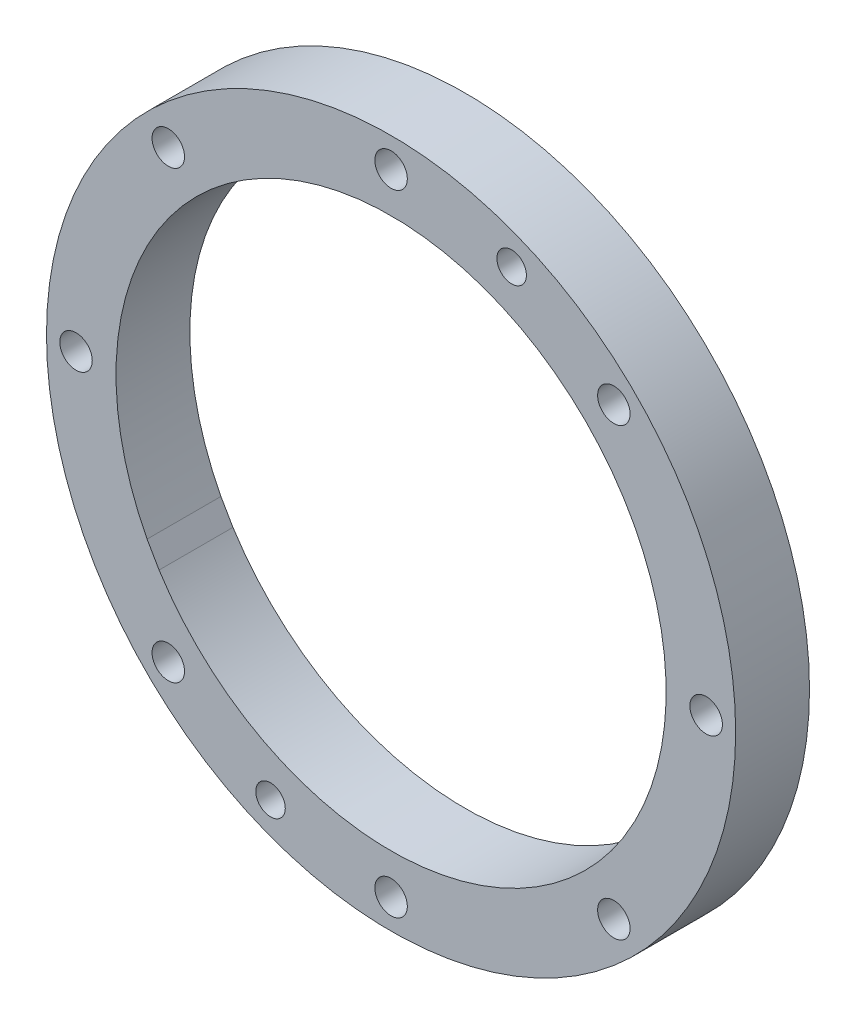
ISO-10303-21;
HEADER;
FILE_DESCRIPTION(('STEP AP214'),'2;1');
FILE_NAME('part.step','',(''),(''),'','','');
FILE_SCHEMA(('AUTOMOTIVE_DESIGN { 1 0 10303 214 1 1 1 1 }'));
ENDSEC;
DATA;
#1=APPLICATION_CONTEXT('core data for automotive mechanical design processes');
#2=APPLICATION_PROTOCOL_DEFINITION('international standard','automotive_design',2000,#1);
#3=PRODUCT_CONTEXT('',#1,'mechanical');
#4=PRODUCT('Part','Part','',(#3));
#5=PRODUCT_RELATED_PRODUCT_CATEGORY('part','',(#4));
#6=PRODUCT_DEFINITION_FORMATION('','',#4);
#7=PRODUCT_DEFINITION_CONTEXT('part definition',#1,'design');
#8=PRODUCT_DEFINITION('design','',#6,#7);
#9=PRODUCT_DEFINITION_SHAPE('','',#8);
#10=(LENGTH_UNIT() NAMED_UNIT(*) SI_UNIT(.MILLI.,.METRE.));
#11=(NAMED_UNIT(*) PLANE_ANGLE_UNIT() SI_UNIT($,.RADIAN.));
#12=(NAMED_UNIT(*) SI_UNIT($,.STERADIAN.) SOLID_ANGLE_UNIT());
#13=UNCERTAINTY_MEASURE_WITH_UNIT(LENGTH_MEASURE(1.E-05),#10,'distance_accuracy_value','');
#14=(GEOMETRIC_REPRESENTATION_CONTEXT(3) GLOBAL_UNCERTAINTY_ASSIGNED_CONTEXT((#13)) GLOBAL_UNIT_ASSIGNED_CONTEXT((#10,
#11,#12)) REPRESENTATION_CONTEXT('',''));
#15=CARTESIAN_POINT('',(0.,0.,0.));
#16=DIRECTION('',(0.,0.,1.));
#17=DIRECTION('',(1.,0.,0.));
#18=AXIS2_PLACEMENT_3D('',#15,#16,#17);
#19=CARTESIAN_POINT('',(0.,0.,7.5));
#20=DIRECTION('',(0.,0.,1.));
#21=DIRECTION('',(1.,0.,0.));
#22=AXIS2_PLACEMENT_3D('',#19,#20,#21);
#23=PLANE('',#22);
#24=CARTESIAN_POINT('',(24.4917396713657,59.1282900807224,7.5));
#25=DIRECTION('',(0.,0.,1.));
#26=DIRECTION('',(1.,0.,0.));
#27=AXIS2_PLACEMENT_3D('',#24,#25,#26);
#28=CIRCLE('',#27,3.);
#29=CARTESIAN_POINT('',(27.4917396713657,59.1282900807224,7.5));
#30=VERTEX_POINT('',#29);
#31=EDGE_CURVE('E407',#30,#30,#28,.T.);
#32=ORIENTED_EDGE('',*,*,#31,.F.);
#33=EDGE_LOOP('',(#32));
#34=FACE_BOUND('',#33,.T.);
#35=CARTESIAN_POINT('',(0.,-64.,7.5));
#36=DIRECTION('',(0.,0.,1.));
#37=DIRECTION('',(1.,0.,0.));
#38=AXIS2_PLACEMENT_3D('',#35,#36,#37);
#39=CIRCLE('',#38,3.3);
#40=CARTESIAN_POINT('',(3.29999999999999,-64.,7.5));
#41=VERTEX_POINT('',#40);
#42=EDGE_CURVE('E425',#41,#41,#39,.T.);
#43=ORIENTED_EDGE('',*,*,#42,.F.);
#44=EDGE_LOOP('',(#43));
#45=FACE_BOUND('',#44,.T.);
#46=CARTESIAN_POINT('',(-64.,0.,7.5));
#47=DIRECTION('',(0.,0.,1.));
#48=DIRECTION('',(1.,0.,0.));
#49=AXIS2_PLACEMENT_3D('',#46,#47,#48);
#50=CIRCLE('',#49,3.3);
#51=CARTESIAN_POINT('',(-60.7,0.,7.5));
#52=VERTEX_POINT('',#51);
#53=EDGE_CURVE('E443',#52,#52,#50,.T.);
#54=ORIENTED_EDGE('',*,*,#53,.F.);
#55=EDGE_LOOP('',(#54));
#56=FACE_BOUND('',#55,.T.);
#57=CARTESIAN_POINT('',(0.,64.,7.5));
#58=DIRECTION('',(0.,0.,1.));
#59=DIRECTION('',(1.,0.,0.));
#60=AXIS2_PLACEMENT_3D('',#57,#58,#59);
#61=CIRCLE('',#60,3.3);
#62=CARTESIAN_POINT('',(3.3,64.,7.5));
#63=VERTEX_POINT('',#62);
#64=EDGE_CURVE('E460',#63,#63,#61,.T.);
#65=ORIENTED_EDGE('',*,*,#64,.F.);
#66=EDGE_LOOP('',(#65));
#67=FACE_BOUND('',#66,.T.);
#68=CARTESIAN_POINT('',(64.,0.,7.5));
#69=DIRECTION('',(0.,0.,1.));
#70=DIRECTION('',(1.,0.,0.));
#71=AXIS2_PLACEMENT_3D('',#68,#69,#70);
#72=CIRCLE('',#71,3.3);
#73=CARTESIAN_POINT('',(67.3,0.,7.5));
#74=VERTEX_POINT('',#73);
#75=EDGE_CURVE('E147',#74,#74,#72,.T.);
#76=ORIENTED_EDGE('',*,*,#75,.F.);
#77=EDGE_LOOP('',(#76));
#78=FACE_BOUND('',#77,.T.);
#79=CARTESIAN_POINT('',(0.,0.,7.5));
#80=DIRECTION('',(0.,0.,1.));
#81=DIRECTION('',(1.,0.,0.));
#82=AXIS2_PLACEMENT_3D('',#79,#80,#81);
#83=CIRCLE('',#82,70.);
#84=CARTESIAN_POINT('',(70.,0.,7.5));
#85=VERTEX_POINT('',#84);
#86=EDGE_CURVE('E11',#85,#85,#83,.T.);
#87=ORIENTED_EDGE('',*,*,#86,.T.);
#88=EDGE_LOOP('',(#87));
#89=FACE_BOUND('',#88,.T.);
#90=DIRECTION('',(-1.,0.,0.));
#91=VECTOR('',#90,1.);
#92=CARTESIAN_POINT('',(2.43723326903816,55.8218193808863,7.5));
#93=LINE('',#92,#91);
#94=CARTESIAN_POINT('',(2.43723326903816,55.8218193808863,7.5));
#95=VERTEX_POINT('',#94);
#96=CARTESIAN_POINT('',(-2.43723326903814,55.8218193808863,7.5));
#97=VERTEX_POINT('',#96);
#98=EDGE_CURVE('E114',#95,#97,#93,.T.);
#99=ORIENTED_EDGE('',*,*,#98,.F.);
#100=CARTESIAN_POINT('',(0.,0.,7.5));
#101=DIRECTION('',(0.,0.,1.));
#102=DIRECTION('',(1.,0.,0.));
#103=AXIS2_PLACEMENT_3D('',#100,#101,#102);
#104=CIRCLE('',#103,55.875);
#105=CARTESIAN_POINT('',(49.5617303038331,-25.8002037645075,7.5));
#106=VERTEX_POINT('',#105);
#107=EDGE_CURVE('E103',#106,#95,#104,.T.);
#108=ORIENTED_EDGE('',*,*,#107,.F.);
#109=DIRECTION('',(0.499999999999999,0.866025403784439,0.));
#110=VECTOR('',#109,1.);
#111=CARTESIAN_POINT('',(47.124497034795,-30.0216156163788,7.5));
#112=LINE('',#111,#110);
#113=CARTESIAN_POINT('',(47.124497034795,-30.0216156163788,7.5));
#114=VERTEX_POINT('',#113);
#115=EDGE_CURVE('E141',#114,#106,#112,.T.);
#116=ORIENTED_EDGE('',*,*,#115,.F.);
#117=CARTESIAN_POINT('',(0.,0.,7.5));
#118=DIRECTION('',(0.,0.,1.));
#119=DIRECTION('',(1.,0.,0.));
#120=AXIS2_PLACEMENT_3D('',#117,#118,#119);
#121=CIRCLE('',#120,55.875);
#122=CARTESIAN_POINT('',(-47.124497034795,-30.0216156163788,7.5));
#123=VERTEX_POINT('',#122);
#124=EDGE_CURVE('E138',#123,#114,#121,.T.);
#125=ORIENTED_EDGE('',*,*,#124,.F.);
#126=DIRECTION('',(0.499999999999999,-0.866025403784439,0.));
#127=VECTOR('',#126,1.);
#128=CARTESIAN_POINT('',(-49.5617303038331,-25.8002037645075,7.5));
#129=LINE('',#128,#127);
#130=CARTESIAN_POINT('',(-49.5617303038332,-25.8002037645075,7.5));
#131=VERTEX_POINT('',#130);
#132=EDGE_CURVE('E135',#131,#123,#129,.T.);
#133=ORIENTED_EDGE('',*,*,#132,.F.);
#134=CARTESIAN_POINT('',(0.,0.,7.5));
#135=DIRECTION('',(0.,0.,1.));
#136=DIRECTION('',(1.,0.,0.));
#137=AXIS2_PLACEMENT_3D('',#134,#135,#136);
#138=CIRCLE('',#137,55.875);
#139=EDGE_CURVE('E126',#97,#131,#138,.T.);
#140=ORIENTED_EDGE('',*,*,#139,.F.);
#141=EDGE_LOOP('',(#99,#108,#116,#125,#133,#140));
#142=FACE_BOUND('',#141,.T.);
#143=CARTESIAN_POINT('',(45.254833995939,45.254833995939,7.5));
#144=DIRECTION('',(0.,0.,1.));
#145=DIRECTION('',(1.,0.,0.));
#146=AXIS2_PLACEMENT_3D('',#143,#144,#145);
#147=CIRCLE('',#146,3.3);
#148=CARTESIAN_POINT('',(48.554833995939,45.254833995939,7.5));
#149=VERTEX_POINT('',#148);
#150=EDGE_CURVE('E463',#149,#149,#147,.T.);
#151=ORIENTED_EDGE('',*,*,#150,.F.);
#152=EDGE_LOOP('',(#151));
#153=FACE_BOUND('',#152,.T.);
#154=CARTESIAN_POINT('',(-45.254833995939,45.254833995939,7.5));
#155=DIRECTION('',(0.,0.,1.));
#156=DIRECTION('',(1.,0.,0.));
#157=AXIS2_PLACEMENT_3D('',#154,#155,#156);
#158=CIRCLE('',#157,3.3);
#159=CARTESIAN_POINT('',(-41.954833995939,45.254833995939,7.5));
#160=VERTEX_POINT('',#159);
#161=EDGE_CURVE('E447',#160,#160,#158,.T.);
#162=ORIENTED_EDGE('',*,*,#161,.F.);
#163=EDGE_LOOP('',(#162));
#164=FACE_BOUND('',#163,.T.);
#165=CARTESIAN_POINT('',(-45.2548339959391,-45.254833995939,7.5));
#166=DIRECTION('',(0.,0.,1.));
#167=DIRECTION('',(1.,0.,0.));
#168=AXIS2_PLACEMENT_3D('',#165,#166,#167);
#169=CIRCLE('',#168,3.3);
#170=CARTESIAN_POINT('',(-41.9548339959391,-45.254833995939,7.5));
#171=VERTEX_POINT('',#170);
#172=EDGE_CURVE('E434',#171,#171,#169,.T.);
#173=ORIENTED_EDGE('',*,*,#172,.F.);
#174=EDGE_LOOP('',(#173));
#175=FACE_BOUND('',#174,.T.);
#176=CARTESIAN_POINT('',(45.254833995939,-45.2548339959391,7.5));
#177=DIRECTION('',(0.,0.,1.));
#178=DIRECTION('',(1.,0.,0.));
#179=AXIS2_PLACEMENT_3D('',#176,#177,#178);
#180=CIRCLE('',#179,3.3);
#181=CARTESIAN_POINT('',(48.554833995939,-45.2548339959391,7.5));
#182=VERTEX_POINT('',#181);
#183=EDGE_CURVE('E420',#182,#182,#180,.T.);
#184=ORIENTED_EDGE('',*,*,#183,.F.);
#185=EDGE_LOOP('',(#184));
#186=FACE_BOUND('',#185,.T.);
#187=CARTESIAN_POINT('',(-24.4917396713657,-59.1282900807224,7.5));
#188=DIRECTION('',(0.,0.,1.));
#189=DIRECTION('',(1.,0.,0.));
#190=AXIS2_PLACEMENT_3D('',#187,#188,#189);
#191=CIRCLE('',#190,3.);
#192=CARTESIAN_POINT('',(-21.4917396713657,-59.1282900807224,7.5));
#193=VERTEX_POINT('',#192);
#194=EDGE_CURVE('E396',#193,#193,#191,.T.);
#195=ORIENTED_EDGE('',*,*,#194,.F.);
#196=EDGE_LOOP('',(#195));
#197=FACE_BOUND('',#196,.T.);
#198=ADVANCED_FACE('F51',(#34,#45,#56,#67,#78,#89,#142,#153,#164,#175,#186,#197),#23,.T.);
#199=CARTESIAN_POINT('',(0.,0.,-7.5));
#200=DIRECTION('',(0.,0.,1.));
#201=DIRECTION('',(1.,0.,0.));
#202=AXIS2_PLACEMENT_3D('',#199,#200,#201);
#203=PLANE('',#202);
#204=CARTESIAN_POINT('',(0.,0.,-7.5));
#205=DIRECTION('',(0.,0.,1.));
#206=DIRECTION('',(1.,0.,0.));
#207=AXIS2_PLACEMENT_3D('',#204,#205,#206);
#208=CIRCLE('',#207,70.);
#209=CARTESIAN_POINT('',(70.,0.,-7.5));
#210=VERTEX_POINT('',#209);
#211=EDGE_CURVE('E54',#210,#210,#208,.T.);
#212=ORIENTED_EDGE('',*,*,#211,.F.);
#213=EDGE_LOOP('',(#212));
#214=FACE_BOUND('',#213,.T.);
#215=CARTESIAN_POINT('',(0.,0.,-7.5));
#216=DIRECTION('',(0.,0.,1.));
#217=DIRECTION('',(1.,0.,0.));
#218=AXIS2_PLACEMENT_3D('',#215,#216,#217);
#219=CIRCLE('',#218,55.875);
#220=CARTESIAN_POINT('',(49.5617303038331,-25.8002037645075,-7.5));
#221=VERTEX_POINT('',#220);
#222=CARTESIAN_POINT('',(2.43723326903816,55.8218193808863,-7.5));
#223=VERTEX_POINT('',#222);
#224=EDGE_CURVE('E75',#221,#223,#219,.T.);
#225=ORIENTED_EDGE('',*,*,#224,.T.);
#226=DIRECTION('',(-1.,0.,0.));
#227=VECTOR('',#226,1.);
#228=CARTESIAN_POINT('',(2.43723326903816,55.8218193808863,-7.5));
#229=LINE('',#228,#227);
#230=CARTESIAN_POINT('',(-2.43723326903814,55.8218193808863,-7.5));
#231=VERTEX_POINT('',#230);
#232=EDGE_CURVE('E123',#223,#231,#229,.T.);
#233=ORIENTED_EDGE('',*,*,#232,.T.);
#234=CARTESIAN_POINT('',(0.,0.,-7.5));
#235=DIRECTION('',(0.,0.,1.));
#236=DIRECTION('',(1.,0.,0.));
#237=AXIS2_PLACEMENT_3D('',#234,#235,#236);
#238=CIRCLE('',#237,55.875);
#239=CARTESIAN_POINT('',(-49.5617303038332,-25.8002037645075,-7.5));
#240=VERTEX_POINT('',#239);
#241=EDGE_CURVE('E146',#231,#240,#238,.T.);
#242=ORIENTED_EDGE('',*,*,#241,.T.);
#243=DIRECTION('',(0.499999999999999,-0.866025403784439,0.));
#244=VECTOR('',#243,1.);
#245=CARTESIAN_POINT('',(-49.5617303038331,-25.8002037645075,-7.5));
#246=LINE('',#245,#244);
#247=CARTESIAN_POINT('',(-47.124497034795,-30.0216156163788,-7.5));
#248=VERTEX_POINT('',#247);
#249=EDGE_CURVE('E154',#240,#248,#246,.T.);
#250=ORIENTED_EDGE('',*,*,#249,.T.);
#251=CARTESIAN_POINT('',(0.,0.,-7.5));
#252=DIRECTION('',(0.,0.,1.));
#253=DIRECTION('',(1.,0.,0.));
#254=AXIS2_PLACEMENT_3D('',#251,#252,#253);
#255=CIRCLE('',#254,55.875);
#256=CARTESIAN_POINT('',(47.124497034795,-30.0216156163788,-7.5));
#257=VERTEX_POINT('',#256);
#258=EDGE_CURVE('E160',#248,#257,#255,.T.);
#259=ORIENTED_EDGE('',*,*,#258,.T.);
#260=DIRECTION('',(0.499999999999999,0.866025403784439,0.));
#261=VECTOR('',#260,1.);
#262=CARTESIAN_POINT('',(47.124497034795,-30.0216156163788,-7.5));
#263=LINE('',#262,#261);
#264=EDGE_CURVE('E113',#257,#221,#263,.T.);
#265=ORIENTED_EDGE('',*,*,#264,.T.);
#266=EDGE_LOOP('',(#225,#233,#242,#250,#259,#265));
#267=FACE_BOUND('',#266,.T.);
#268=CARTESIAN_POINT('',(64.,0.,-7.5));
#269=DIRECTION('',(0.,0.,1.));
#270=DIRECTION('',(1.,0.,0.));
#271=AXIS2_PLACEMENT_3D('',#268,#269,#270);
#272=CIRCLE('',#271,3.3);
#273=CARTESIAN_POINT('',(67.3,0.,-7.5));
#274=VERTEX_POINT('',#273);
#275=EDGE_CURVE('E468',#274,#274,#272,.T.);
#276=ORIENTED_EDGE('',*,*,#275,.T.);
#277=EDGE_LOOP('',(#276));
#278=FACE_BOUND('',#277,.T.);
#279=CARTESIAN_POINT('',(45.254833995939,45.254833995939,-7.5));
#280=DIRECTION('',(0.,0.,1.));
#281=DIRECTION('',(1.,0.,0.));
#282=AXIS2_PLACEMENT_3D('',#279,#280,#281);
#283=CIRCLE('',#282,3.3);
#284=CARTESIAN_POINT('',(48.554833995939,45.254833995939,-7.5));
#285=VERTEX_POINT('',#284);
#286=EDGE_CURVE('E462',#285,#285,#283,.T.);
#287=ORIENTED_EDGE('',*,*,#286,.T.);
#288=EDGE_LOOP('',(#287));
#289=FACE_BOUND('',#288,.T.);
#290=CARTESIAN_POINT('',(0.,64.,-7.5));
#291=DIRECTION('',(0.,0.,1.));
#292=DIRECTION('',(1.,0.,0.));
#293=AXIS2_PLACEMENT_3D('',#290,#291,#292);
#294=CIRCLE('',#293,3.3);
#295=CARTESIAN_POINT('',(3.3,64.,-7.5));
#296=VERTEX_POINT('',#295);
#297=EDGE_CURVE('E453',#296,#296,#294,.T.);
#298=ORIENTED_EDGE('',*,*,#297,.T.);
#299=EDGE_LOOP('',(#298));
#300=FACE_BOUND('',#299,.T.);
#301=CARTESIAN_POINT('',(-45.254833995939,45.254833995939,-7.5));
#302=DIRECTION('',(0.,0.,1.));
#303=DIRECTION('',(1.,0.,0.));
#304=AXIS2_PLACEMENT_3D('',#301,#302,#303);
#305=CIRCLE('',#304,3.3);
#306=CARTESIAN_POINT('',(-41.954833995939,45.254833995939,-7.5));
#307=VERTEX_POINT('',#306);
#308=EDGE_CURVE('E442',#307,#307,#305,.T.);
#309=ORIENTED_EDGE('',*,*,#308,.T.);
#310=EDGE_LOOP('',(#309));
#311=FACE_BOUND('',#310,.T.);
#312=CARTESIAN_POINT('',(-64.,0.,-7.5));
#313=DIRECTION('',(0.,0.,1.));
#314=DIRECTION('',(1.,0.,0.));
#315=AXIS2_PLACEMENT_3D('',#312,#313,#314);
#316=CIRCLE('',#315,3.3);
#317=CARTESIAN_POINT('',(-60.7,0.,-7.5));
#318=VERTEX_POINT('',#317);
#319=EDGE_CURVE('E437',#318,#318,#316,.T.);
#320=ORIENTED_EDGE('',*,*,#319,.T.);
#321=EDGE_LOOP('',(#320));
#322=FACE_BOUND('',#321,.T.);
#323=CARTESIAN_POINT('',(-45.2548339959391,-45.254833995939,-7.5));
#324=DIRECTION('',(0.,0.,1.));
#325=DIRECTION('',(1.,0.,0.));
#326=AXIS2_PLACEMENT_3D('',#323,#324,#325);
#327=CIRCLE('',#326,3.3);
#328=CARTESIAN_POINT('',(-41.9548339959391,-45.254833995939,-7.5));
#329=VERTEX_POINT('',#328);
#330=EDGE_CURVE('E429',#329,#329,#327,.T.);
#331=ORIENTED_EDGE('',*,*,#330,.T.);
#332=EDGE_LOOP('',(#331));
#333=FACE_BOUND('',#332,.T.);
#334=CARTESIAN_POINT('',(0.,-64.,-7.5));
#335=DIRECTION('',(0.,0.,1.));
#336=DIRECTION('',(1.,0.,0.));
#337=AXIS2_PLACEMENT_3D('',#334,#335,#336);
#338=CIRCLE('',#337,3.3);
#339=CARTESIAN_POINT('',(3.29999999999999,-64.,-7.5));
#340=VERTEX_POINT('',#339);
#341=EDGE_CURVE('E421',#340,#340,#338,.T.);
#342=ORIENTED_EDGE('',*,*,#341,.T.);
#343=EDGE_LOOP('',(#342));
#344=FACE_BOUND('',#343,.T.);
#345=CARTESIAN_POINT('',(45.254833995939,-45.2548339959391,-7.5));
#346=DIRECTION('',(0.,0.,1.));
#347=DIRECTION('',(1.,0.,0.));
#348=AXIS2_PLACEMENT_3D('',#345,#346,#347);
#349=CIRCLE('',#348,3.3);
#350=CARTESIAN_POINT('',(48.554833995939,-45.2548339959391,-7.5));
#351=VERTEX_POINT('',#350);
#352=EDGE_CURVE('E412',#351,#351,#349,.T.);
#353=ORIENTED_EDGE('',*,*,#352,.T.);
#354=EDGE_LOOP('',(#353));
#355=FACE_BOUND('',#354,.T.);
#356=CARTESIAN_POINT('',(24.4917396713657,59.1282900807224,-7.5));
#357=DIRECTION('',(0.,0.,1.));
#358=DIRECTION('',(1.,0.,0.));
#359=AXIS2_PLACEMENT_3D('',#356,#357,#358);
#360=CIRCLE('',#359,3.);
#361=CARTESIAN_POINT('',(27.4917396713657,59.1282900807224,-7.5));
#362=VERTEX_POINT('',#361);
#363=EDGE_CURVE('E406',#362,#362,#360,.T.);
#364=ORIENTED_EDGE('',*,*,#363,.T.);
#365=EDGE_LOOP('',(#364));
#366=FACE_BOUND('',#365,.T.);
#367=CARTESIAN_POINT('',(-24.4917396713657,-59.1282900807224,-7.5));
#368=DIRECTION('',(0.,0.,1.));
#369=DIRECTION('',(1.,0.,0.));
#370=AXIS2_PLACEMENT_3D('',#367,#368,#369);
#371=CIRCLE('',#370,3.);
#372=CARTESIAN_POINT('',(-21.4917396713657,-59.1282900807224,-7.5));
#373=VERTEX_POINT('',#372);
#374=EDGE_CURVE('E401',#373,#373,#371,.T.);
#375=ORIENTED_EDGE('',*,*,#374,.T.);
#376=EDGE_LOOP('',(#375));
#377=FACE_BOUND('',#376,.T.);
#378=ADVANCED_FACE('F181',(#214,#267,#278,#289,#300,#311,#322,#333,#344,#355,#366,#377),#203,.F.);
#379=CARTESIAN_POINT('',(0.,0.,7.5));
#380=DIRECTION('',(0.,0.,-1.));
#381=DIRECTION('',(-1.,0.,0.));
#382=AXIS2_PLACEMENT_3D('',#379,#380,#381);
#383=CYLINDRICAL_SURFACE('',#382,70.);
#384=ORIENTED_EDGE('',*,*,#86,.F.);
#385=EDGE_LOOP('',(#384));
#386=FACE_BOUND('',#385,.T.);
#387=ORIENTED_EDGE('',*,*,#211,.T.);
#388=EDGE_LOOP('',(#387));
#389=FACE_BOUND('',#388,.T.);
#390=ADVANCED_FACE('F52',(#386,#389),#383,.T.);
#391=CARTESIAN_POINT('',(0.,0.,7.5));
#392=DIRECTION('',(0.,0.,-1.));
#393=DIRECTION('',(-1.,0.,0.));
#394=AXIS2_PLACEMENT_3D('',#391,#392,#393);
#395=CYLINDRICAL_SURFACE('',#394,55.875);
#396=ORIENTED_EDGE('',*,*,#224,.F.);
#397=DIRECTION('',(0.,0.,-1.));
#398=VECTOR('',#397,1.);
#399=CARTESIAN_POINT('',(49.5617303038331,-25.8002037645075,7.5));
#400=LINE('',#399,#398);
#401=EDGE_CURVE('E108',#106,#221,#400,.T.);
#402=ORIENTED_EDGE('',*,*,#401,.F.);
#403=ORIENTED_EDGE('',*,*,#107,.T.);
#404=DIRECTION('',(0.,0.,-1.));
#405=VECTOR('',#404,1.);
#406=CARTESIAN_POINT('',(2.43723326903816,55.8218193808863,7.5));
#407=LINE('',#406,#405);
#408=EDGE_CURVE('E109',#95,#223,#407,.T.);
#409=ORIENTED_EDGE('',*,*,#408,.T.);
#410=EDGE_LOOP('',(#396,#402,#403,#409));
#411=FACE_BOUND('',#410,.T.);
#412=ADVANCED_FACE('F107',(#411),#395,.F.);
#413=CARTESIAN_POINT('',(2.43723326903816,55.8218193808863,7.5));
#414=DIRECTION('',(0.,-1.,0.));
#415=DIRECTION('',(0.,0.,-1.));
#416=AXIS2_PLACEMENT_3D('',#413,#414,#415);
#417=PLANE('',#416);
#418=ORIENTED_EDGE('',*,*,#232,.F.);
#419=ORIENTED_EDGE('',*,*,#408,.F.);
#420=ORIENTED_EDGE('',*,*,#98,.T.);
#421=DIRECTION('',(0.,0.,-1.));
#422=VECTOR('',#421,1.);
#423=CARTESIAN_POINT('',(-2.43723326903814,55.8218193808863,7.5));
#424=LINE('',#423,#422);
#425=EDGE_CURVE('E121',#97,#231,#424,.T.);
#426=ORIENTED_EDGE('',*,*,#425,.T.);
#427=EDGE_LOOP('',(#418,#419,#420,#426));
#428=FACE_BOUND('',#427,.T.);
#429=ADVANCED_FACE('F119',(#428),#417,.T.);
#430=CARTESIAN_POINT('',(0.,0.,7.5));
#431=DIRECTION('',(0.,0.,-1.));
#432=DIRECTION('',(-1.,0.,0.));
#433=AXIS2_PLACEMENT_3D('',#430,#431,#432);
#434=CYLINDRICAL_SURFACE('',#433,55.875);
#435=ORIENTED_EDGE('',*,*,#241,.F.);
#436=ORIENTED_EDGE('',*,*,#425,.F.);
#437=ORIENTED_EDGE('',*,*,#139,.T.);
#438=DIRECTION('',(0.,0.,-1.));
#439=VECTOR('',#438,1.);
#440=CARTESIAN_POINT('',(-49.5617303038332,-25.8002037645075,7.5));
#441=LINE('',#440,#439);
#442=EDGE_CURVE('E173',#131,#240,#441,.T.);
#443=ORIENTED_EDGE('',*,*,#442,.T.);
#444=EDGE_LOOP('',(#435,#436,#437,#443));
#445=FACE_BOUND('',#444,.T.);
#446=ADVANCED_FACE('F180',(#445),#434,.F.);
#447=CARTESIAN_POINT('',(-49.5617303038331,-25.8002037645075,7.5));
#448=DIRECTION('',(0.866025403784439,0.499999999999999,0.));
#449=DIRECTION('',(-0.499999999999999,0.866025403784439,0.));
#450=AXIS2_PLACEMENT_3D('',#447,#448,#449);
#451=PLANE('',#450);
#452=ORIENTED_EDGE('',*,*,#249,.F.);
#453=ORIENTED_EDGE('',*,*,#442,.F.);
#454=ORIENTED_EDGE('',*,*,#132,.T.);
#455=DIRECTION('',(0.,0.,-1.));
#456=VECTOR('',#455,1.);
#457=CARTESIAN_POINT('',(-47.124497034795,-30.0216156163788,7.5));
#458=LINE('',#457,#456);
#459=EDGE_CURVE('E166',#123,#248,#458,.T.);
#460=ORIENTED_EDGE('',*,*,#459,.T.);
#461=EDGE_LOOP('',(#452,#453,#454,#460));
#462=FACE_BOUND('',#461,.T.);
#463=ADVANCED_FACE('F189',(#462),#451,.T.);
#464=CARTESIAN_POINT('',(0.,0.,7.5));
#465=DIRECTION('',(0.,0.,-1.));
#466=DIRECTION('',(-1.,0.,0.));
#467=AXIS2_PLACEMENT_3D('',#464,#465,#466);
#468=CYLINDRICAL_SURFACE('',#467,55.875);
#469=ORIENTED_EDGE('',*,*,#258,.F.);
#470=ORIENTED_EDGE('',*,*,#459,.F.);
#471=ORIENTED_EDGE('',*,*,#124,.T.);
#472=DIRECTION('',(0.,0.,-1.));
#473=VECTOR('',#472,1.);
#474=CARTESIAN_POINT('',(47.124497034795,-30.0216156163788,7.5));
#475=LINE('',#474,#473);
#476=EDGE_CURVE('E70',#114,#257,#475,.T.);
#477=ORIENTED_EDGE('',*,*,#476,.T.);
#478=EDGE_LOOP('',(#469,#470,#471,#477));
#479=FACE_BOUND('',#478,.T.);
#480=ADVANCED_FACE('F187',(#479),#468,.F.);
#481=CARTESIAN_POINT('',(47.124497034795,-30.0216156163788,7.5));
#482=DIRECTION('',(-0.866025403784439,0.499999999999999,0.));
#483=DIRECTION('',(-0.499999999999999,-0.866025403784439,0.));
#484=AXIS2_PLACEMENT_3D('',#481,#482,#483);
#485=PLANE('',#484);
#486=ORIENTED_EDGE('',*,*,#264,.F.);
#487=ORIENTED_EDGE('',*,*,#476,.F.);
#488=ORIENTED_EDGE('',*,*,#115,.T.);
#489=ORIENTED_EDGE('',*,*,#401,.T.);
#490=EDGE_LOOP('',(#486,#487,#488,#489));
#491=FACE_BOUND('',#490,.T.);
#492=ADVANCED_FACE('F182',(#491),#485,.T.);
#493=CARTESIAN_POINT('',(64.,0.,7.5));
#494=DIRECTION('',(0.,0.,-1.));
#495=DIRECTION('',(-1.,0.,0.));
#496=AXIS2_PLACEMENT_3D('',#493,#494,#495);
#497=CYLINDRICAL_SURFACE('',#496,3.3);
#498=ORIENTED_EDGE('',*,*,#75,.T.);
#499=EDGE_LOOP('',(#498));
#500=FACE_BOUND('',#499,.T.);
#501=ORIENTED_EDGE('',*,*,#275,.F.);
#502=EDGE_LOOP('',(#501));
#503=FACE_BOUND('',#502,.T.);
#504=ADVANCED_FACE('F238',(#500,#503),#497,.F.);
#505=CARTESIAN_POINT('',(45.254833995939,45.254833995939,7.5));
#506=DIRECTION('',(0.,0.,-1.));
#507=DIRECTION('',(-1.,0.,0.));
#508=AXIS2_PLACEMENT_3D('',#505,#506,#507);
#509=CYLINDRICAL_SURFACE('',#508,3.3);
#510=ORIENTED_EDGE('',*,*,#150,.T.);
#511=EDGE_LOOP('',(#510));
#512=FACE_BOUND('',#511,.T.);
#513=ORIENTED_EDGE('',*,*,#286,.F.);
#514=EDGE_LOOP('',(#513));
#515=FACE_BOUND('',#514,.T.);
#516=ADVANCED_FACE('F249',(#512,#515),#509,.F.);
#517=CARTESIAN_POINT('',(0.,64.,7.5));
#518=DIRECTION('',(0.,0.,-1.));
#519=DIRECTION('',(-1.,0.,0.));
#520=AXIS2_PLACEMENT_3D('',#517,#518,#519);
#521=CYLINDRICAL_SURFACE('',#520,3.3);
#522=ORIENTED_EDGE('',*,*,#64,.T.);
#523=EDGE_LOOP('',(#522));
#524=FACE_BOUND('',#523,.T.);
#525=ORIENTED_EDGE('',*,*,#297,.F.);
#526=EDGE_LOOP('',(#525));
#527=FACE_BOUND('',#526,.T.);
#528=ADVANCED_FACE('F260',(#524,#527),#521,.F.);
#529=CARTESIAN_POINT('',(-45.254833995939,45.254833995939,7.5));
#530=DIRECTION('',(0.,0.,-1.));
#531=DIRECTION('',(-1.,0.,0.));
#532=AXIS2_PLACEMENT_3D('',#529,#530,#531);
#533=CYLINDRICAL_SURFACE('',#532,3.3);
#534=ORIENTED_EDGE('',*,*,#161,.T.);
#535=EDGE_LOOP('',(#534));
#536=FACE_BOUND('',#535,.T.);
#537=ORIENTED_EDGE('',*,*,#308,.F.);
#538=EDGE_LOOP('',(#537));
#539=FACE_BOUND('',#538,.T.);
#540=ADVANCED_FACE('F267',(#536,#539),#533,.F.);
#541=CARTESIAN_POINT('',(-64.,0.,7.5));
#542=DIRECTION('',(0.,0.,-1.));
#543=DIRECTION('',(-1.,0.,0.));
#544=AXIS2_PLACEMENT_3D('',#541,#542,#543);
#545=CYLINDRICAL_SURFACE('',#544,3.3);
#546=ORIENTED_EDGE('',*,*,#53,.T.);
#547=EDGE_LOOP('',(#546));
#548=FACE_BOUND('',#547,.T.);
#549=ORIENTED_EDGE('',*,*,#319,.F.);
#550=EDGE_LOOP('',(#549));
#551=FACE_BOUND('',#550,.T.);
#552=ADVANCED_FACE('F278',(#548,#551),#545,.F.);
#553=CARTESIAN_POINT('',(-45.2548339959391,-45.254833995939,7.5));
#554=DIRECTION('',(0.,0.,-1.));
#555=DIRECTION('',(-1.,0.,0.));
#556=AXIS2_PLACEMENT_3D('',#553,#554,#555);
#557=CYLINDRICAL_SURFACE('',#556,3.3);
#558=ORIENTED_EDGE('',*,*,#172,.T.);
#559=EDGE_LOOP('',(#558));
#560=FACE_BOUND('',#559,.T.);
#561=ORIENTED_EDGE('',*,*,#330,.F.);
#562=EDGE_LOOP('',(#561));
#563=FACE_BOUND('',#562,.T.);
#564=ADVANCED_FACE('F288',(#560,#563),#557,.F.);
#565=CARTESIAN_POINT('',(0.,-64.,7.5));
#566=DIRECTION('',(0.,0.,-1.));
#567=DIRECTION('',(-1.,0.,0.));
#568=AXIS2_PLACEMENT_3D('',#565,#566,#567);
#569=CYLINDRICAL_SURFACE('',#568,3.3);
#570=ORIENTED_EDGE('',*,*,#42,.T.);
#571=EDGE_LOOP('',(#570));
#572=FACE_BOUND('',#571,.T.);
#573=ORIENTED_EDGE('',*,*,#341,.F.);
#574=EDGE_LOOP('',(#573));
#575=FACE_BOUND('',#574,.T.);
#576=ADVANCED_FACE('F298',(#572,#575),#569,.F.);
#577=CARTESIAN_POINT('',(45.254833995939,-45.2548339959391,7.5));
#578=DIRECTION('',(0.,0.,-1.));
#579=DIRECTION('',(-1.,0.,0.));
#580=AXIS2_PLACEMENT_3D('',#577,#578,#579);
#581=CYLINDRICAL_SURFACE('',#580,3.3);
#582=ORIENTED_EDGE('',*,*,#183,.T.);
#583=EDGE_LOOP('',(#582));
#584=FACE_BOUND('',#583,.T.);
#585=ORIENTED_EDGE('',*,*,#352,.F.);
#586=EDGE_LOOP('',(#585));
#587=FACE_BOUND('',#586,.T.);
#588=ADVANCED_FACE('F309',(#584,#587),#581,.F.);
#589=CARTESIAN_POINT('',(24.4917396713657,59.1282900807224,7.5));
#590=DIRECTION('',(0.,0.,-1.));
#591=DIRECTION('',(-1.,0.,0.));
#592=AXIS2_PLACEMENT_3D('',#589,#590,#591);
#593=CYLINDRICAL_SURFACE('',#592,3.);
#594=ORIENTED_EDGE('',*,*,#31,.T.);
#595=EDGE_LOOP('',(#594));
#596=FACE_BOUND('',#595,.T.);
#597=ORIENTED_EDGE('',*,*,#363,.F.);
#598=EDGE_LOOP('',(#597));
#599=FACE_BOUND('',#598,.T.);
#600=ADVANCED_FACE('F317',(#596,#599),#593,.F.);
#601=CARTESIAN_POINT('',(-24.4917396713657,-59.1282900807224,7.5));
#602=DIRECTION('',(0.,0.,-1.));
#603=DIRECTION('',(-1.,0.,0.));
#604=AXIS2_PLACEMENT_3D('',#601,#602,#603);
#605=CYLINDRICAL_SURFACE('',#604,3.);
#606=ORIENTED_EDGE('',*,*,#194,.T.);
#607=EDGE_LOOP('',(#606));
#608=FACE_BOUND('',#607,.T.);
#609=ORIENTED_EDGE('',*,*,#374,.F.);
#610=EDGE_LOOP('',(#609));
#611=FACE_BOUND('',#610,.T.);
#612=ADVANCED_FACE('F326',(#608,#611),#605,.F.);
#613=CLOSED_SHELL('',(#198,#378,#390,#412,#429,#446,#463,#480,#492,#504,#516,#528,#540,#552,
#564,#576,#588,#600,#612));
#614=MANIFOLD_SOLID_BREP('B2',#613);
#615=ADVANCED_BREP_SHAPE_REPRESENTATION('',(#18,#614),#14);
#616=SHAPE_DEFINITION_REPRESENTATION(#9,#615);
ENDSEC;
END-ISO-10303-21;
